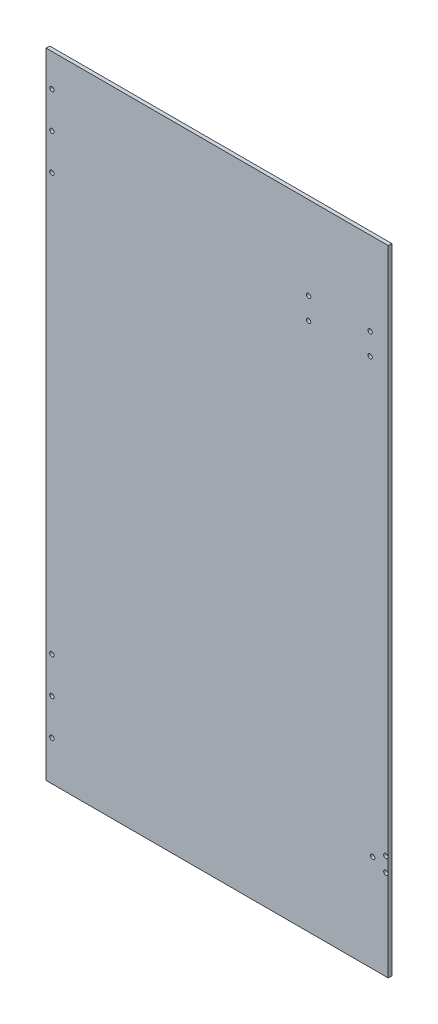
ISO-10303-21;
HEADER;
FILE_DESCRIPTION(('STEP AP214'),'2;1');
FILE_NAME('part.step','',(''),(''),'','','');
FILE_SCHEMA(('AUTOMOTIVE_DESIGN { 1 0 10303 214 1 1 1 1 }'));
ENDSEC;
DATA;
#1=APPLICATION_CONTEXT('core data for automotive mechanical design processes');
#2=APPLICATION_PROTOCOL_DEFINITION('international standard','automotive_design',2000,#1);
#3=PRODUCT_CONTEXT('',#1,'mechanical');
#4=PRODUCT('Part','Part','',(#3));
#5=PRODUCT_RELATED_PRODUCT_CATEGORY('part','',(#4));
#6=PRODUCT_DEFINITION_FORMATION('','',#4);
#7=PRODUCT_DEFINITION_CONTEXT('part definition',#1,'design');
#8=PRODUCT_DEFINITION('design','',#6,#7);
#9=PRODUCT_DEFINITION_SHAPE('','',#8);
#10=(LENGTH_UNIT() NAMED_UNIT(*) SI_UNIT(.MILLI.,.METRE.));
#11=(NAMED_UNIT(*) PLANE_ANGLE_UNIT() SI_UNIT($,.RADIAN.));
#12=(NAMED_UNIT(*) SI_UNIT($,.STERADIAN.) SOLID_ANGLE_UNIT());
#13=UNCERTAINTY_MEASURE_WITH_UNIT(LENGTH_MEASURE(1.E-05),#10,'distance_accuracy_value','');
#14=(GEOMETRIC_REPRESENTATION_CONTEXT(3) GLOBAL_UNCERTAINTY_ASSIGNED_CONTEXT((#13)) GLOBAL_UNIT_ASSIGNED_CONTEXT((#10,
#11,#12)) REPRESENTATION_CONTEXT('',''));
#15=CARTESIAN_POINT('',(0.,0.,0.));
#16=DIRECTION('',(0.,0.,1.));
#17=DIRECTION('',(1.,0.,0.));
#18=AXIS2_PLACEMENT_3D('',#15,#16,#17);
#19=CARTESIAN_POINT('',(0.,0.,6.35));
#20=DIRECTION('',(1.,0.,0.));
#21=DIRECTION('',(0.,1.,0.));
#22=AXIS2_PLACEMENT_3D('',#19,#20,#21);
#23=PLANE('',#22);
#24=DIRECTION('',(0.,-1.,0.));
#25=VECTOR('',#24,1.);
#26=CARTESIAN_POINT('',(0.,0.,0.));
#27=LINE('',#26,#25);
#28=CARTESIAN_POINT('',(0.,0.,0.));
#29=VERTEX_POINT('',#28);
#30=CARTESIAN_POINT('',(1.36244405698741E-13,-1112.52,0.));
#31=VERTEX_POINT('',#30);
#32=EDGE_CURVE('E96',#29,#31,#27,.T.);
#33=ORIENTED_EDGE('',*,*,#32,.T.);
#34=DIRECTION('',(0.,0.,-1.));
#35=VECTOR('',#34,1.);
#36=CARTESIAN_POINT('',(1.36244405698741E-13,-1112.52,6.35));
#37=LINE('',#36,#35);
#38=CARTESIAN_POINT('',(1.36244405698741E-13,-1112.52,6.35));
#39=VERTEX_POINT('',#38);
#40=EDGE_CURVE('E11',#39,#31,#37,.T.);
#41=ORIENTED_EDGE('',*,*,#40,.F.);
#42=DIRECTION('',(0.,-1.,0.));
#43=VECTOR('',#42,1.);
#44=CARTESIAN_POINT('',(0.,0.,6.35));
#45=LINE('',#44,#43);
#46=CARTESIAN_POINT('',(0.,0.,6.35));
#47=VERTEX_POINT('',#46);
#48=EDGE_CURVE('E84',#47,#39,#45,.T.);
#49=ORIENTED_EDGE('',*,*,#48,.F.);
#50=DIRECTION('',(0.,0.,-1.));
#51=VECTOR('',#50,1.);
#52=CARTESIAN_POINT('',(0.,0.,6.35));
#53=LINE('',#52,#51);
#54=EDGE_CURVE('E92',#47,#29,#53,.T.);
#55=ORIENTED_EDGE('',*,*,#54,.T.);
#56=EDGE_LOOP('',(#33,#41,#49,#55));
#57=FACE_BOUND('',#56,.T.);
#58=ADVANCED_FACE('F33',(#57),#23,.F.);
#59=CARTESIAN_POINT('',(1.36244405698741E-13,-1112.52,6.35));
#60=DIRECTION('',(0.,1.,0.));
#61=DIRECTION('',(0.,0.,1.));
#62=AXIS2_PLACEMENT_3D('',#59,#60,#61);
#63=PLANE('',#62);
#64=DIRECTION('',(1.,0.,0.));
#65=VECTOR('',#64,1.);
#66=CARTESIAN_POINT('',(1.36244405698741E-13,-1112.52,0.));
#67=LINE('',#66,#65);
#68=CARTESIAN_POINT('',(600.075,-1112.52,0.));
#69=VERTEX_POINT('',#68);
#70=EDGE_CURVE('E88',#31,#69,#67,.T.);
#71=ORIENTED_EDGE('',*,*,#70,.T.);
#72=DIRECTION('',(0.,0.,-1.));
#73=VECTOR('',#72,1.);
#74=CARTESIAN_POINT('',(600.075,-1112.52,6.35));
#75=LINE('',#74,#73);
#76=CARTESIAN_POINT('',(600.075,-1112.52,6.35));
#77=VERTEX_POINT('',#76);
#78=EDGE_CURVE('E41',#77,#69,#75,.T.);
#79=ORIENTED_EDGE('',*,*,#78,.F.);
#80=DIRECTION('',(1.,0.,0.));
#81=VECTOR('',#80,1.);
#82=CARTESIAN_POINT('',(1.36244405698741E-13,-1112.52,6.35));
#83=LINE('',#82,#81);
#84=EDGE_CURVE('E79',#39,#77,#83,.T.);
#85=ORIENTED_EDGE('',*,*,#84,.F.);
#86=ORIENTED_EDGE('',*,*,#40,.T.);
#87=EDGE_LOOP('',(#71,#79,#85,#86));
#88=FACE_BOUND('',#87,.T.);
#89=ADVANCED_FACE('F87',(#88),#63,.F.);
#90=CARTESIAN_POINT('',(600.075,0.,6.35));
#91=DIRECTION('',(-1.,0.,0.));
#92=DIRECTION('',(0.,-1.,0.));
#93=AXIS2_PLACEMENT_3D('',#90,#91,#92);
#94=PLANE('',#93);
#95=DIRECTION('',(0.,1.,0.));
#96=VECTOR('',#95,1.);
#97=CARTESIAN_POINT('',(600.075,0.,0.));
#98=LINE('',#97,#96);
#99=CARTESIAN_POINT('',(600.075,0.,0.));
#100=VERTEX_POINT('',#99);
#101=EDGE_CURVE('E66',#69,#100,#98,.T.);
#102=ORIENTED_EDGE('',*,*,#101,.T.);
#103=DIRECTION('',(0.,0.,-1.));
#104=VECTOR('',#103,1.);
#105=CARTESIAN_POINT('',(600.075,0.,6.35));
#106=LINE('',#105,#104);
#107=CARTESIAN_POINT('',(600.075,0.,6.35));
#108=VERTEX_POINT('',#107);
#109=EDGE_CURVE('E89',#108,#100,#106,.T.);
#110=ORIENTED_EDGE('',*,*,#109,.F.);
#111=DIRECTION('',(0.,1.,0.));
#112=VECTOR('',#111,1.);
#113=CARTESIAN_POINT('',(600.075,0.,6.35));
#114=LINE('',#113,#112);
#115=EDGE_CURVE('E82',#77,#108,#114,.T.);
#116=ORIENTED_EDGE('',*,*,#115,.F.);
#117=ORIENTED_EDGE('',*,*,#78,.T.);
#118=EDGE_LOOP('',(#102,#110,#116,#117));
#119=FACE_BOUND('',#118,.T.);
#120=ADVANCED_FACE('F90',(#119),#94,.F.);
#121=CARTESIAN_POINT('',(0.,0.,6.35));
#122=DIRECTION('',(0.,-1.,0.));
#123=DIRECTION('',(0.,0.,-1.));
#124=AXIS2_PLACEMENT_3D('',#121,#122,#123);
#125=PLANE('',#124);
#126=DIRECTION('',(-1.,0.,0.));
#127=VECTOR('',#126,1.);
#128=CARTESIAN_POINT('',(0.,0.,0.));
#129=LINE('',#128,#127);
#130=EDGE_CURVE('E72',#100,#29,#129,.T.);
#131=ORIENTED_EDGE('',*,*,#130,.T.);
#132=ORIENTED_EDGE('',*,*,#54,.F.);
#133=DIRECTION('',(-1.,0.,0.));
#134=VECTOR('',#133,1.);
#135=CARTESIAN_POINT('',(0.,0.,6.35));
#136=LINE('',#135,#134);
#137=EDGE_CURVE('E49',#108,#47,#136,.T.);
#138=ORIENTED_EDGE('',*,*,#137,.F.);
#139=ORIENTED_EDGE('',*,*,#109,.T.);
#140=EDGE_LOOP('',(#131,#132,#138,#139));
#141=FACE_BOUND('',#140,.T.);
#142=ADVANCED_FACE('F104',(#141),#125,.F.);
#143=CARTESIAN_POINT('',(0.,0.,6.35));
#144=DIRECTION('',(0.,0.,1.));
#145=DIRECTION('',(1.,0.,0.));
#146=AXIS2_PLACEMENT_3D('',#143,#144,#145);
#147=PLANE('',#146);
#148=CARTESIAN_POINT('',(10.1092000001281,-184.149999999907,6.35));
#149=DIRECTION('',(0.,0.,-1.));
#150=DIRECTION('',(-1.,0.,0.));
#151=AXIS2_PLACEMENT_3D('',#148,#149,#150);
#152=CIRCLE('',#151,3.81);
#153=CARTESIAN_POINT('',(6.29920000012808,-184.149999999907,6.35));
#154=VERTEX_POINT('',#153);
#155=EDGE_CURVE('E132',#154,#154,#152,.T.);
#156=ORIENTED_EDGE('',*,*,#155,.T.);
#157=EDGE_LOOP('',(#156));
#158=FACE_BOUND('',#157,.T.);
#159=CARTESIAN_POINT('',(595.8205,-954.689000231095,6.35));
#160=DIRECTION('',(0.,0.,-1.));
#161=DIRECTION('',(-1.,0.,0.));
#162=AXIS2_PLACEMENT_3D('',#159,#160,#161);
#163=CIRCLE('',#162,3.81);
#164=CARTESIAN_POINT('',(592.0105,-954.689000231095,6.35));
#165=VERTEX_POINT('',#164);
#166=EDGE_CURVE('E143',#165,#165,#163,.T.);
#167=ORIENTED_EDGE('',*,*,#166,.T.);
#168=EDGE_LOOP('',(#167));
#169=FACE_BOUND('',#168,.T.);
#170=CARTESIAN_POINT('',(10.109200000136,-915.669999999907,6.35));
#171=DIRECTION('',(0.,0.,-1.));
#172=DIRECTION('',(-1.,0.,0.));
#173=AXIS2_PLACEMENT_3D('',#170,#171,#172);
#174=CIRCLE('',#173,3.81000000000001);
#175=CARTESIAN_POINT('',(6.29920000013598,-915.669999999907,6.35));
#176=VERTEX_POINT('',#175);
#177=EDGE_CURVE('E144',#176,#176,#174,.T.);
#178=ORIENTED_EDGE('',*,*,#177,.T.);
#179=EDGE_LOOP('',(#178));
#180=FACE_BOUND('',#179,.T.);
#181=CARTESIAN_POINT('',(10.109200000136,-979.169999999907,6.35));
#182=DIRECTION('',(0.,0.,-1.));
#183=DIRECTION('',(-1.,0.,0.));
#184=AXIS2_PLACEMENT_3D('',#181,#182,#183);
#185=CIRCLE('',#184,3.81000000000001);
#186=CARTESIAN_POINT('',(6.29920000013598,-979.169999999907,6.35));
#187=VERTEX_POINT('',#186);
#188=EDGE_CURVE('E155',#187,#187,#185,.T.);
#189=ORIENTED_EDGE('',*,*,#188,.T.);
#190=EDGE_LOOP('',(#189));
#191=FACE_BOUND('',#190,.T.);
#192=CARTESIAN_POINT('',(460.375,-146.05,6.35));
#193=DIRECTION('',(0.,0.,-1.));
#194=DIRECTION('',(-1.,0.,0.));
#195=AXIS2_PLACEMENT_3D('',#192,#193,#194);
#196=CIRCLE('',#195,3.80999999999998);
#197=CARTESIAN_POINT('',(456.565,-146.05,6.35));
#198=VERTEX_POINT('',#197);
#199=EDGE_CURVE('E113',#198,#198,#196,.T.);
#200=ORIENTED_EDGE('',*,*,#199,.T.);
#201=EDGE_LOOP('',(#200));
#202=FACE_BOUND('',#201,.T.);
#203=CARTESIAN_POINT('',(10.109200000132,-120.649999999907,6.35));
#204=DIRECTION('',(0.,0.,-1.));
#205=DIRECTION('',(-1.,0.,0.));
#206=AXIS2_PLACEMENT_3D('',#203,#204,#205);
#207=CIRCLE('',#206,3.81);
#208=CARTESIAN_POINT('',(6.29920000013205,-120.649999999907,6.35));
#209=VERTEX_POINT('',#208);
#210=EDGE_CURVE('E119',#209,#209,#207,.T.);
#211=ORIENTED_EDGE('',*,*,#210,.T.);
#212=EDGE_LOOP('',(#211));
#213=FACE_BOUND('',#212,.T.);
#214=CARTESIAN_POINT('',(10.109200000136,-57.1499999999072,6.35));
#215=DIRECTION('',(0.,0.,-1.));
#216=DIRECTION('',(-1.,0.,0.));
#217=AXIS2_PLACEMENT_3D('',#214,#215,#216);
#218=CIRCLE('',#217,3.81);
#219=CARTESIAN_POINT('',(6.299200000136,-57.1499999999072,6.35));
#220=VERTEX_POINT('',#219);
#221=EDGE_CURVE('E120',#220,#220,#218,.T.);
#222=ORIENTED_EDGE('',*,*,#221,.T.);
#223=EDGE_LOOP('',(#222));
#224=FACE_BOUND('',#223,.T.);
#225=CARTESIAN_POINT('',(595.8205,-929.289000231095,6.35));
#226=DIRECTION('',(0.,0.,-1.));
#227=DIRECTION('',(-1.,0.,0.));
#228=AXIS2_PLACEMENT_3D('',#225,#226,#227);
#229=CIRCLE('',#228,3.81);
#230=CARTESIAN_POINT('',(592.0105,-929.289000231095,6.35));
#231=VERTEX_POINT('',#230);
#232=EDGE_CURVE('E131',#231,#231,#229,.T.);
#233=ORIENTED_EDGE('',*,*,#232,.T.);
#234=EDGE_LOOP('',(#233));
#235=FACE_BOUND('',#234,.T.);
#236=CARTESIAN_POINT('',(572.854666666666,-941.989000231095,6.35));
#237=DIRECTION('',(0.,0.,-1.));
#238=DIRECTION('',(-1.,0.,0.));
#239=AXIS2_PLACEMENT_3D('',#236,#237,#238);
#240=CIRCLE('',#239,3.81);
#241=CARTESIAN_POINT('',(569.044666666666,-941.989000231095,6.35));
#242=VERTEX_POINT('',#241);
#243=EDGE_CURVE('E156',#242,#242,#240,.T.);
#244=ORIENTED_EDGE('',*,*,#243,.T.);
#245=EDGE_LOOP('',(#244));
#246=FACE_BOUND('',#245,.T.);
#247=CARTESIAN_POINT('',(10.109200000136,-1042.66999999991,6.35));
#248=DIRECTION('',(0.,0.,-1.));
#249=DIRECTION('',(-1.,0.,0.));
#250=AXIS2_PLACEMENT_3D('',#247,#248,#249);
#251=CIRCLE('',#250,3.81000000000001);
#252=CARTESIAN_POINT('',(6.29920000013598,-1042.66999999991,6.35));
#253=VERTEX_POINT('',#252);
#254=EDGE_CURVE('E179',#253,#253,#251,.T.);
#255=ORIENTED_EDGE('',*,*,#254,.T.);
#256=EDGE_LOOP('',(#255));
#257=FACE_BOUND('',#256,.T.);
#258=CARTESIAN_POINT('',(460.375,-184.15,6.35));
#259=DIRECTION('',(0.,0.,-1.));
#260=DIRECTION('',(-1.,0.,0.));
#261=AXIS2_PLACEMENT_3D('',#258,#259,#260);
#262=CIRCLE('',#261,3.80999999999998);
#263=CARTESIAN_POINT('',(456.565,-184.15,6.35));
#264=VERTEX_POINT('',#263);
#265=EDGE_CURVE('E173',#264,#264,#262,.T.);
#266=ORIENTED_EDGE('',*,*,#265,.T.);
#267=EDGE_LOOP('',(#266));
#268=FACE_BOUND('',#267,.T.);
#269=CARTESIAN_POINT('',(568.325,-184.15,6.35));
#270=DIRECTION('',(0.,0.,-1.));
#271=DIRECTION('',(-1.,0.,0.));
#272=AXIS2_PLACEMENT_3D('',#269,#270,#271);
#273=CIRCLE('',#272,3.80999999999998);
#274=CARTESIAN_POINT('',(564.515,-184.15,6.35));
#275=VERTEX_POINT('',#274);
#276=EDGE_CURVE('E167',#275,#275,#273,.T.);
#277=ORIENTED_EDGE('',*,*,#276,.T.);
#278=EDGE_LOOP('',(#277));
#279=FACE_BOUND('',#278,.T.);
#280=CARTESIAN_POINT('',(568.325,-146.05,6.35));
#281=DIRECTION('',(0.,0.,-1.));
#282=DIRECTION('',(-1.,0.,0.));
#283=AXIS2_PLACEMENT_3D('',#280,#281,#282);
#284=CIRCLE('',#283,3.80999999999998);
#285=CARTESIAN_POINT('',(564.515,-146.05,6.35));
#286=VERTEX_POINT('',#285);
#287=EDGE_CURVE('E99',#286,#286,#284,.T.);
#288=ORIENTED_EDGE('',*,*,#287,.T.);
#289=EDGE_LOOP('',(#288));
#290=FACE_BOUND('',#289,.T.);
#291=ORIENTED_EDGE('',*,*,#48,.T.);
#292=ORIENTED_EDGE('',*,*,#84,.T.);
#293=ORIENTED_EDGE('',*,*,#115,.T.);
#294=ORIENTED_EDGE('',*,*,#137,.T.);
#295=EDGE_LOOP('',(#291,#292,#293,#294));
#296=FACE_BOUND('',#295,.T.);
#297=ADVANCED_FACE('F80',(#158,#169,#180,#191,#202,#213,#224,#235,#246,#257,#268,#279,#290,
#296),#147,.T.);
#298=CARTESIAN_POINT('',(0.,0.,0.));
#299=DIRECTION('',(0.,0.,1.));
#300=DIRECTION('',(1.,0.,0.));
#301=AXIS2_PLACEMENT_3D('',#298,#299,#300);
#302=PLANE('',#301);
#303=CARTESIAN_POINT('',(10.1092000001281,-184.149999999907,0.));
#304=DIRECTION('',(0.,0.,-1.));
#305=DIRECTION('',(-1.,0.,0.));
#306=AXIS2_PLACEMENT_3D('',#303,#304,#305);
#307=CIRCLE('',#306,3.81);
#308=CARTESIAN_POINT('',(6.29920000012808,-184.149999999907,0.));
#309=VERTEX_POINT('',#308);
#310=EDGE_CURVE('E147',#309,#309,#307,.T.);
#311=ORIENTED_EDGE('',*,*,#310,.F.);
#312=EDGE_LOOP('',(#311));
#313=FACE_BOUND('',#312,.T.);
#314=CARTESIAN_POINT('',(595.8205,-954.689000231095,0.));
#315=DIRECTION('',(0.,0.,-1.));
#316=DIRECTION('',(-1.,0.,0.));
#317=AXIS2_PLACEMENT_3D('',#314,#315,#316);
#318=CIRCLE('',#317,3.81);
#319=CARTESIAN_POINT('',(592.0105,-954.689000231095,0.));
#320=VERTEX_POINT('',#319);
#321=EDGE_CURVE('E140',#320,#320,#318,.T.);
#322=ORIENTED_EDGE('',*,*,#321,.F.);
#323=EDGE_LOOP('',(#322));
#324=FACE_BOUND('',#323,.T.);
#325=CARTESIAN_POINT('',(10.109200000136,-915.669999999907,0.));
#326=DIRECTION('',(0.,0.,-1.));
#327=DIRECTION('',(-1.,0.,0.));
#328=AXIS2_PLACEMENT_3D('',#325,#326,#327);
#329=CIRCLE('',#328,3.81000000000001);
#330=CARTESIAN_POINT('',(6.29920000013598,-915.669999999907,0.));
#331=VERTEX_POINT('',#330);
#332=EDGE_CURVE('E159',#331,#331,#329,.T.);
#333=ORIENTED_EDGE('',*,*,#332,.F.);
#334=EDGE_LOOP('',(#333));
#335=FACE_BOUND('',#334,.T.);
#336=CARTESIAN_POINT('',(10.109200000136,-979.169999999907,0.));
#337=DIRECTION('',(0.,0.,-1.));
#338=DIRECTION('',(-1.,0.,0.));
#339=AXIS2_PLACEMENT_3D('',#336,#337,#338);
#340=CIRCLE('',#339,3.81000000000001);
#341=CARTESIAN_POINT('',(6.29920000013598,-979.169999999907,0.));
#342=VERTEX_POINT('',#341);
#343=EDGE_CURVE('E152',#342,#342,#340,.T.);
#344=ORIENTED_EDGE('',*,*,#343,.F.);
#345=EDGE_LOOP('',(#344));
#346=FACE_BOUND('',#345,.T.);
#347=CARTESIAN_POINT('',(460.375,-146.05,0.));
#348=DIRECTION('',(0.,0.,-1.));
#349=DIRECTION('',(-1.,0.,0.));
#350=AXIS2_PLACEMENT_3D('',#347,#348,#349);
#351=CIRCLE('',#350,3.80999999999998);
#352=CARTESIAN_POINT('',(456.565,-146.05,0.));
#353=VERTEX_POINT('',#352);
#354=EDGE_CURVE('E123',#353,#353,#351,.T.);
#355=ORIENTED_EDGE('',*,*,#354,.F.);
#356=EDGE_LOOP('',(#355));
#357=FACE_BOUND('',#356,.T.);
#358=CARTESIAN_POINT('',(10.109200000132,-120.649999999907,0.));
#359=DIRECTION('',(0.,0.,-1.));
#360=DIRECTION('',(-1.,0.,0.));
#361=AXIS2_PLACEMENT_3D('',#358,#359,#360);
#362=CIRCLE('',#361,3.81);
#363=CARTESIAN_POINT('',(6.29920000013205,-120.649999999907,0.));
#364=VERTEX_POINT('',#363);
#365=EDGE_CURVE('E116',#364,#364,#362,.T.);
#366=ORIENTED_EDGE('',*,*,#365,.F.);
#367=EDGE_LOOP('',(#366));
#368=FACE_BOUND('',#367,.T.);
#369=CARTESIAN_POINT('',(10.109200000136,-57.1499999999072,0.));
#370=DIRECTION('',(0.,0.,-1.));
#371=DIRECTION('',(-1.,0.,0.));
#372=AXIS2_PLACEMENT_3D('',#369,#370,#371);
#373=CIRCLE('',#372,3.81);
#374=CARTESIAN_POINT('',(6.299200000136,-57.1499999999072,0.));
#375=VERTEX_POINT('',#374);
#376=EDGE_CURVE('E135',#375,#375,#373,.T.);
#377=ORIENTED_EDGE('',*,*,#376,.F.);
#378=EDGE_LOOP('',(#377));
#379=FACE_BOUND('',#378,.T.);
#380=CARTESIAN_POINT('',(595.8205,-929.289000231095,0.));
#381=DIRECTION('',(0.,0.,-1.));
#382=DIRECTION('',(-1.,0.,0.));
#383=AXIS2_PLACEMENT_3D('',#380,#381,#382);
#384=CIRCLE('',#383,3.81);
#385=CARTESIAN_POINT('',(592.0105,-929.289000231095,0.));
#386=VERTEX_POINT('',#385);
#387=EDGE_CURVE('E128',#386,#386,#384,.T.);
#388=ORIENTED_EDGE('',*,*,#387,.F.);
#389=EDGE_LOOP('',(#388));
#390=FACE_BOUND('',#389,.T.);
#391=CARTESIAN_POINT('',(572.854666666666,-941.989000231095,0.));
#392=DIRECTION('',(0.,0.,-1.));
#393=DIRECTION('',(-1.,0.,0.));
#394=AXIS2_PLACEMENT_3D('',#391,#392,#393);
#395=CIRCLE('',#394,3.81);
#396=CARTESIAN_POINT('',(569.044666666666,-941.989000231095,0.));
#397=VERTEX_POINT('',#396);
#398=EDGE_CURVE('E182',#397,#397,#395,.T.);
#399=ORIENTED_EDGE('',*,*,#398,.F.);
#400=EDGE_LOOP('',(#399));
#401=FACE_BOUND('',#400,.T.);
#402=CARTESIAN_POINT('',(10.109200000136,-1042.66999999991,0.));
#403=DIRECTION('',(0.,0.,-1.));
#404=DIRECTION('',(-1.,0.,0.));
#405=AXIS2_PLACEMENT_3D('',#402,#403,#404);
#406=CIRCLE('',#405,3.81000000000001);
#407=CARTESIAN_POINT('',(6.29920000013598,-1042.66999999991,0.));
#408=VERTEX_POINT('',#407);
#409=EDGE_CURVE('E176',#408,#408,#406,.T.);
#410=ORIENTED_EDGE('',*,*,#409,.F.);
#411=EDGE_LOOP('',(#410));
#412=FACE_BOUND('',#411,.T.);
#413=CARTESIAN_POINT('',(460.375,-184.15,0.));
#414=DIRECTION('',(0.,0.,-1.));
#415=DIRECTION('',(-1.,0.,0.));
#416=AXIS2_PLACEMENT_3D('',#413,#414,#415);
#417=CIRCLE('',#416,3.80999999999998);
#418=CARTESIAN_POINT('',(456.565,-184.15,0.));
#419=VERTEX_POINT('',#418);
#420=EDGE_CURVE('E170',#419,#419,#417,.T.);
#421=ORIENTED_EDGE('',*,*,#420,.F.);
#422=EDGE_LOOP('',(#421));
#423=FACE_BOUND('',#422,.T.);
#424=CARTESIAN_POINT('',(568.325,-184.15,0.));
#425=DIRECTION('',(0.,0.,-1.));
#426=DIRECTION('',(-1.,0.,0.));
#427=AXIS2_PLACEMENT_3D('',#424,#425,#426);
#428=CIRCLE('',#427,3.80999999999998);
#429=CARTESIAN_POINT('',(564.515,-184.15,0.));
#430=VERTEX_POINT('',#429);
#431=EDGE_CURVE('E164',#430,#430,#428,.T.);
#432=ORIENTED_EDGE('',*,*,#431,.F.);
#433=EDGE_LOOP('',(#432));
#434=FACE_BOUND('',#433,.T.);
#435=CARTESIAN_POINT('',(568.325,-146.05,0.));
#436=DIRECTION('',(0.,0.,-1.));
#437=DIRECTION('',(-1.,0.,0.));
#438=AXIS2_PLACEMENT_3D('',#435,#436,#437);
#439=CIRCLE('',#438,3.80999999999998);
#440=CARTESIAN_POINT('',(564.515,-146.05,0.));
#441=VERTEX_POINT('',#440);
#442=EDGE_CURVE('E110',#441,#441,#439,.T.);
#443=ORIENTED_EDGE('',*,*,#442,.F.);
#444=EDGE_LOOP('',(#443));
#445=FACE_BOUND('',#444,.T.);
#446=ORIENTED_EDGE('',*,*,#32,.F.);
#447=ORIENTED_EDGE('',*,*,#130,.F.);
#448=ORIENTED_EDGE('',*,*,#101,.F.);
#449=ORIENTED_EDGE('',*,*,#70,.F.);
#450=EDGE_LOOP('',(#446,#447,#448,#449));
#451=FACE_BOUND('',#450,.T.);
#452=ADVANCED_FACE('F107',(#313,#324,#335,#346,#357,#368,#379,#390,#401,#412,#423,#434,#445,
#451),#302,.F.);
#453=CARTESIAN_POINT('',(568.325,-146.05,6.35));
#454=DIRECTION('',(0.,0.,-1.));
#455=DIRECTION('',(-1.,0.,0.));
#456=AXIS2_PLACEMENT_3D('',#453,#454,#455);
#457=CYLINDRICAL_SURFACE('',#456,3.80999999999998);
#458=ORIENTED_EDGE('',*,*,#287,.F.);
#459=EDGE_LOOP('',(#458));
#460=FACE_BOUND('',#459,.T.);
#461=ORIENTED_EDGE('',*,*,#442,.T.);
#462=EDGE_LOOP('',(#461));
#463=FACE_BOUND('',#462,.T.);
#464=ADVANCED_FACE('F200',(#460,#463),#457,.F.);
#465=CARTESIAN_POINT('',(568.325,-184.15,6.35));
#466=DIRECTION('',(0.,0.,-1.));
#467=DIRECTION('',(-1.,0.,0.));
#468=AXIS2_PLACEMENT_3D('',#465,#466,#467);
#469=CYLINDRICAL_SURFACE('',#468,3.80999999999998);
#470=ORIENTED_EDGE('',*,*,#276,.F.);
#471=EDGE_LOOP('',(#470));
#472=FACE_BOUND('',#471,.T.);
#473=ORIENTED_EDGE('',*,*,#431,.T.);
#474=EDGE_LOOP('',(#473));
#475=FACE_BOUND('',#474,.T.);
#476=ADVANCED_FACE('F212',(#472,#475),#469,.F.);
#477=CARTESIAN_POINT('',(460.375,-184.15,6.35));
#478=DIRECTION('',(0.,0.,-1.));
#479=DIRECTION('',(-1.,0.,0.));
#480=AXIS2_PLACEMENT_3D('',#477,#478,#479);
#481=CYLINDRICAL_SURFACE('',#480,3.80999999999998);
#482=ORIENTED_EDGE('',*,*,#265,.F.);
#483=EDGE_LOOP('',(#482));
#484=FACE_BOUND('',#483,.T.);
#485=ORIENTED_EDGE('',*,*,#420,.T.);
#486=EDGE_LOOP('',(#485));
#487=FACE_BOUND('',#486,.T.);
#488=ADVANCED_FACE('F218',(#484,#487),#481,.F.);
#489=CARTESIAN_POINT('',(10.109200000136,-1042.66999999991,6.35));
#490=DIRECTION('',(0.,0.,-1.));
#491=DIRECTION('',(-1.,0.,0.));
#492=AXIS2_PLACEMENT_3D('',#489,#490,#491);
#493=CYLINDRICAL_SURFACE('',#492,3.81000000000001);
#494=ORIENTED_EDGE('',*,*,#254,.F.);
#495=EDGE_LOOP('',(#494));
#496=FACE_BOUND('',#495,.T.);
#497=ORIENTED_EDGE('',*,*,#409,.T.);
#498=EDGE_LOOP('',(#497));
#499=FACE_BOUND('',#498,.T.);
#500=ADVANCED_FACE('F194',(#496,#499),#493,.F.);
#501=CARTESIAN_POINT('',(572.854666666666,-941.989000231095,6.35));
#502=DIRECTION('',(0.,0.,-1.));
#503=DIRECTION('',(-1.,0.,0.));
#504=AXIS2_PLACEMENT_3D('',#501,#502,#503);
#505=CYLINDRICAL_SURFACE('',#504,3.81);
#506=ORIENTED_EDGE('',*,*,#243,.F.);
#507=EDGE_LOOP('',(#506));
#508=FACE_BOUND('',#507,.T.);
#509=ORIENTED_EDGE('',*,*,#398,.T.);
#510=EDGE_LOOP('',(#509));
#511=FACE_BOUND('',#510,.T.);
#512=ADVANCED_FACE('F190',(#508,#511),#505,.F.);
#513=CARTESIAN_POINT('',(595.8205,-929.289000231095,6.35));
#514=DIRECTION('',(0.,0.,-1.));
#515=DIRECTION('',(-1.,0.,0.));
#516=AXIS2_PLACEMENT_3D('',#513,#514,#515);
#517=CYLINDRICAL_SURFACE('',#516,3.81);
#518=ORIENTED_EDGE('',*,*,#232,.F.);
#519=EDGE_LOOP('',(#518));
#520=FACE_BOUND('',#519,.T.);
#521=ORIENTED_EDGE('',*,*,#387,.T.);
#522=EDGE_LOOP('',(#521));
#523=FACE_BOUND('',#522,.T.);
#524=ADVANCED_FACE('F193',(#520,#523),#517,.F.);
#525=CARTESIAN_POINT('',(10.109200000136,-57.1499999999072,6.35));
#526=DIRECTION('',(0.,0.,-1.));
#527=DIRECTION('',(-1.,0.,0.));
#528=AXIS2_PLACEMENT_3D('',#525,#526,#527);
#529=CYLINDRICAL_SURFACE('',#528,3.81);
#530=ORIENTED_EDGE('',*,*,#221,.F.);
#531=EDGE_LOOP('',(#530));
#532=FACE_BOUND('',#531,.T.);
#533=ORIENTED_EDGE('',*,*,#376,.T.);
#534=EDGE_LOOP('',(#533));
#535=FACE_BOUND('',#534,.T.);
#536=ADVANCED_FACE('F256',(#532,#535),#529,.F.);
#537=CARTESIAN_POINT('',(10.109200000132,-120.649999999907,6.35));
#538=DIRECTION('',(0.,0.,-1.));
#539=DIRECTION('',(-1.,0.,0.));
#540=AXIS2_PLACEMENT_3D('',#537,#538,#539);
#541=CYLINDRICAL_SURFACE('',#540,3.81);
#542=ORIENTED_EDGE('',*,*,#210,.F.);
#543=EDGE_LOOP('',(#542));
#544=FACE_BOUND('',#543,.T.);
#545=ORIENTED_EDGE('',*,*,#365,.T.);
#546=EDGE_LOOP('',(#545));
#547=FACE_BOUND('',#546,.T.);
#548=ADVANCED_FACE('F263',(#544,#547),#541,.F.);
#549=CARTESIAN_POINT('',(460.375,-146.05,6.35));
#550=DIRECTION('',(0.,0.,-1.));
#551=DIRECTION('',(-1.,0.,0.));
#552=AXIS2_PLACEMENT_3D('',#549,#550,#551);
#553=CYLINDRICAL_SURFACE('',#552,3.80999999999998);
#554=ORIENTED_EDGE('',*,*,#199,.F.);
#555=EDGE_LOOP('',(#554));
#556=FACE_BOUND('',#555,.T.);
#557=ORIENTED_EDGE('',*,*,#354,.T.);
#558=EDGE_LOOP('',(#557));
#559=FACE_BOUND('',#558,.T.);
#560=ADVANCED_FACE('F268',(#556,#559),#553,.F.);
#561=CARTESIAN_POINT('',(10.109200000136,-979.169999999907,6.35));
#562=DIRECTION('',(0.,0.,-1.));
#563=DIRECTION('',(-1.,0.,0.));
#564=AXIS2_PLACEMENT_3D('',#561,#562,#563);
#565=CYLINDRICAL_SURFACE('',#564,3.81000000000001);
#566=ORIENTED_EDGE('',*,*,#188,.F.);
#567=EDGE_LOOP('',(#566));
#568=FACE_BOUND('',#567,.T.);
#569=ORIENTED_EDGE('',*,*,#343,.T.);
#570=EDGE_LOOP('',(#569));
#571=FACE_BOUND('',#570,.T.);
#572=ADVANCED_FACE('F270',(#568,#571),#565,.F.);
#573=CARTESIAN_POINT('',(10.109200000136,-915.669999999907,6.35));
#574=DIRECTION('',(0.,0.,-1.));
#575=DIRECTION('',(-1.,0.,0.));
#576=AXIS2_PLACEMENT_3D('',#573,#574,#575);
#577=CYLINDRICAL_SURFACE('',#576,3.81000000000001);
#578=ORIENTED_EDGE('',*,*,#177,.F.);
#579=EDGE_LOOP('',(#578));
#580=FACE_BOUND('',#579,.T.);
#581=ORIENTED_EDGE('',*,*,#332,.T.);
#582=EDGE_LOOP('',(#581));
#583=FACE_BOUND('',#582,.T.);
#584=ADVANCED_FACE('F294',(#580,#583),#577,.F.);
#585=CARTESIAN_POINT('',(595.8205,-954.689000231095,6.35));
#586=DIRECTION('',(0.,0.,-1.));
#587=DIRECTION('',(-1.,0.,0.));
#588=AXIS2_PLACEMENT_3D('',#585,#586,#587);
#589=CYLINDRICAL_SURFACE('',#588,3.81);
#590=ORIENTED_EDGE('',*,*,#166,.F.);
#591=EDGE_LOOP('',(#590));
#592=FACE_BOUND('',#591,.T.);
#593=ORIENTED_EDGE('',*,*,#321,.T.);
#594=EDGE_LOOP('',(#593));
#595=FACE_BOUND('',#594,.T.);
#596=ADVANCED_FACE('F302',(#592,#595),#589,.F.);
#597=CARTESIAN_POINT('',(10.1092000001281,-184.149999999907,6.35));
#598=DIRECTION('',(0.,0.,-1.));
#599=DIRECTION('',(-1.,0.,0.));
#600=AXIS2_PLACEMENT_3D('',#597,#598,#599);
#601=CYLINDRICAL_SURFACE('',#600,3.81);
#602=ORIENTED_EDGE('',*,*,#155,.F.);
#603=EDGE_LOOP('',(#602));
#604=FACE_BOUND('',#603,.T.);
#605=ORIENTED_EDGE('',*,*,#310,.T.);
#606=EDGE_LOOP('',(#605));
#607=FACE_BOUND('',#606,.T.);
#608=ADVANCED_FACE('F310',(#604,#607),#601,.F.);
#609=CLOSED_SHELL('',(#58,#89,#120,#142,#297,#452,#464,#476,#488,#500,#512,#524,#536,#548,#560,
#572,#584,#596,#608));
#610=MANIFOLD_SOLID_BREP('B2',#609);
#611=ADVANCED_BREP_SHAPE_REPRESENTATION('',(#18,#610),#14);
#612=SHAPE_DEFINITION_REPRESENTATION(#9,#611);
ENDSEC;
END-ISO-10303-21;
